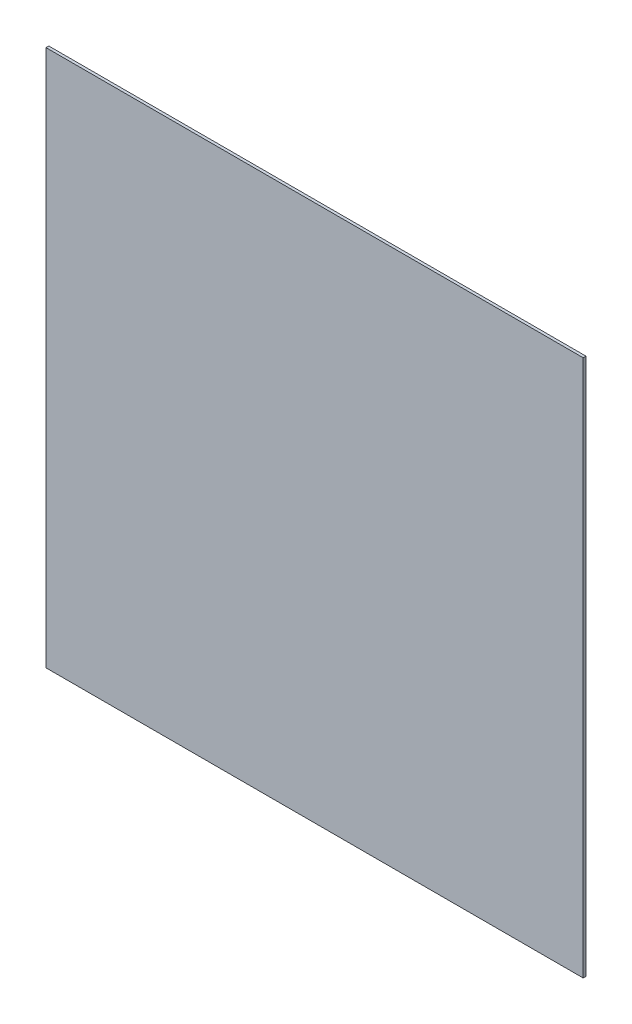
ISO-10303-21;
HEADER;
FILE_DESCRIPTION(('STEP AP214'),'2;1');
FILE_NAME('part.step','',(''),(''),'','','');
FILE_SCHEMA(('AUTOMOTIVE_DESIGN { 1 0 10303 214 1 1 1 1 }'));
ENDSEC;
DATA;
#1=APPLICATION_CONTEXT('core data for automotive mechanical design processes');
#2=APPLICATION_PROTOCOL_DEFINITION('international standard','automotive_design',2000,#1);
#3=PRODUCT_CONTEXT('',#1,'mechanical');
#4=PRODUCT('Part','Part','',(#3));
#5=PRODUCT_RELATED_PRODUCT_CATEGORY('part','',(#4));
#6=PRODUCT_DEFINITION_FORMATION('','',#4);
#7=PRODUCT_DEFINITION_CONTEXT('part definition',#1,'design');
#8=PRODUCT_DEFINITION('design','',#6,#7);
#9=PRODUCT_DEFINITION_SHAPE('','',#8);
#10=(LENGTH_UNIT() NAMED_UNIT(*) SI_UNIT(.MILLI.,.METRE.));
#11=(NAMED_UNIT(*) PLANE_ANGLE_UNIT() SI_UNIT($,.RADIAN.));
#12=(NAMED_UNIT(*) SI_UNIT($,.STERADIAN.) SOLID_ANGLE_UNIT());
#13=UNCERTAINTY_MEASURE_WITH_UNIT(LENGTH_MEASURE(1.E-05),#10,'distance_accuracy_value','');
#14=(GEOMETRIC_REPRESENTATION_CONTEXT(3) GLOBAL_UNCERTAINTY_ASSIGNED_CONTEXT((#13)) GLOBAL_UNIT_ASSIGNED_CONTEXT((#10,
#11,#12)) REPRESENTATION_CONTEXT('',''));
#15=CARTESIAN_POINT('',(0.,0.,0.));
#16=DIRECTION('',(0.,0.,1.));
#17=DIRECTION('',(1.,0.,0.));
#18=AXIS2_PLACEMENT_3D('',#15,#16,#17);
#19=CARTESIAN_POINT('',(609.6,0.,3.175));
#20=DIRECTION('',(0.,1.,0.));
#21=DIRECTION('',(0.,0.,1.));
#22=AXIS2_PLACEMENT_3D('',#19,#20,#21);
#23=PLANE('',#22);
#24=DIRECTION('',(1.,0.,0.));
#25=VECTOR('',#24,1.);
#26=CARTESIAN_POINT('',(609.6,0.,0.));
#27=LINE('',#26,#25);
#28=CARTESIAN_POINT('',(0.,0.,0.));
#29=VERTEX_POINT('',#28);
#30=CARTESIAN_POINT('',(609.6,0.,0.));
#31=VERTEX_POINT('',#30);
#32=EDGE_CURVE('E96',#29,#31,#27,.T.);
#33=ORIENTED_EDGE('',*,*,#32,.T.);
#34=DIRECTION('',(0.,0.,-1.));
#35=VECTOR('',#34,1.);
#36=CARTESIAN_POINT('',(609.6,0.,3.175));
#37=LINE('',#36,#35);
#38=CARTESIAN_POINT('',(609.6,0.,3.175));
#39=VERTEX_POINT('',#38);
#40=EDGE_CURVE('E11',#39,#31,#37,.T.);
#41=ORIENTED_EDGE('',*,*,#40,.F.);
#42=DIRECTION('',(1.,0.,0.));
#43=VECTOR('',#42,1.);
#44=CARTESIAN_POINT('',(609.6,0.,3.175));
#45=LINE('',#44,#43);
#46=CARTESIAN_POINT('',(0.,0.,3.175));
#47=VERTEX_POINT('',#46);
#48=EDGE_CURVE('E84',#47,#39,#45,.T.);
#49=ORIENTED_EDGE('',*,*,#48,.F.);
#50=DIRECTION('',(0.,0.,-1.));
#51=VECTOR('',#50,1.);
#52=CARTESIAN_POINT('',(0.,0.,3.175));
#53=LINE('',#52,#51);
#54=EDGE_CURVE('E92',#47,#29,#53,.T.);
#55=ORIENTED_EDGE('',*,*,#54,.T.);
#56=EDGE_LOOP('',(#33,#41,#49,#55));
#57=FACE_BOUND('',#56,.T.);
#58=ADVANCED_FACE('F33',(#57),#23,.F.);
#59=CARTESIAN_POINT('',(609.6,609.6,3.175));
#60=DIRECTION('',(-1.,0.,0.));
#61=DIRECTION('',(0.,0.,1.));
#62=AXIS2_PLACEMENT_3D('',#59,#60,#61);
#63=PLANE('',#62);
#64=DIRECTION('',(0.,1.,0.));
#65=VECTOR('',#64,1.);
#66=CARTESIAN_POINT('',(609.6,609.6,0.));
#67=LINE('',#66,#65);
#68=CARTESIAN_POINT('',(609.6,609.6,0.));
#69=VERTEX_POINT('',#68);
#70=EDGE_CURVE('E88',#31,#69,#67,.T.);
#71=ORIENTED_EDGE('',*,*,#70,.T.);
#72=DIRECTION('',(0.,0.,-1.));
#73=VECTOR('',#72,1.);
#74=CARTESIAN_POINT('',(609.6,609.6,3.175));
#75=LINE('',#74,#73);
#76=CARTESIAN_POINT('',(609.6,609.6,3.175));
#77=VERTEX_POINT('',#76);
#78=EDGE_CURVE('E41',#77,#69,#75,.T.);
#79=ORIENTED_EDGE('',*,*,#78,.F.);
#80=DIRECTION('',(0.,1.,0.));
#81=VECTOR('',#80,1.);
#82=CARTESIAN_POINT('',(609.6,609.6,3.175));
#83=LINE('',#82,#81);
#84=EDGE_CURVE('E79',#39,#77,#83,.T.);
#85=ORIENTED_EDGE('',*,*,#84,.F.);
#86=ORIENTED_EDGE('',*,*,#40,.T.);
#87=EDGE_LOOP('',(#71,#79,#85,#86));
#88=FACE_BOUND('',#87,.T.);
#89=ADVANCED_FACE('F87',(#88),#63,.F.);
#90=CARTESIAN_POINT('',(0.,609.6,3.175));
#91=DIRECTION('',(0.,-1.,0.));
#92=DIRECTION('',(0.,0.,-1.));
#93=AXIS2_PLACEMENT_3D('',#90,#91,#92);
#94=PLANE('',#93);
#95=DIRECTION('',(-1.,0.,0.));
#96=VECTOR('',#95,1.);
#97=CARTESIAN_POINT('',(0.,609.6,0.));
#98=LINE('',#97,#96);
#99=CARTESIAN_POINT('',(0.,609.6,0.));
#100=VERTEX_POINT('',#99);
#101=EDGE_CURVE('E66',#69,#100,#98,.T.);
#102=ORIENTED_EDGE('',*,*,#101,.T.);
#103=DIRECTION('',(0.,0.,-1.));
#104=VECTOR('',#103,1.);
#105=CARTESIAN_POINT('',(0.,609.6,3.175));
#106=LINE('',#105,#104);
#107=CARTESIAN_POINT('',(0.,609.6,3.175));
#108=VERTEX_POINT('',#107);
#109=EDGE_CURVE('E89',#108,#100,#106,.T.);
#110=ORIENTED_EDGE('',*,*,#109,.F.);
#111=DIRECTION('',(-1.,0.,0.));
#112=VECTOR('',#111,1.);
#113=CARTESIAN_POINT('',(0.,609.6,3.175));
#114=LINE('',#113,#112);
#115=EDGE_CURVE('E82',#77,#108,#114,.T.);
#116=ORIENTED_EDGE('',*,*,#115,.F.);
#117=ORIENTED_EDGE('',*,*,#78,.T.);
#118=EDGE_LOOP('',(#102,#110,#116,#117));
#119=FACE_BOUND('',#118,.T.);
#120=ADVANCED_FACE('F90',(#119),#94,.F.);
#121=CARTESIAN_POINT('',(0.,0.,3.175));
#122=DIRECTION('',(1.,0.,0.));
#123=DIRECTION('',(0.,0.,-1.));
#124=AXIS2_PLACEMENT_3D('',#121,#122,#123);
#125=PLANE('',#124);
#126=DIRECTION('',(0.,-1.,0.));
#127=VECTOR('',#126,1.);
#128=CARTESIAN_POINT('',(0.,0.,0.));
#129=LINE('',#128,#127);
#130=EDGE_CURVE('E72',#100,#29,#129,.T.);
#131=ORIENTED_EDGE('',*,*,#130,.T.);
#132=ORIENTED_EDGE('',*,*,#54,.F.);
#133=DIRECTION('',(0.,-1.,0.));
#134=VECTOR('',#133,1.);
#135=CARTESIAN_POINT('',(0.,0.,3.175));
#136=LINE('',#135,#134);
#137=EDGE_CURVE('E49',#108,#47,#136,.T.);
#138=ORIENTED_EDGE('',*,*,#137,.F.);
#139=ORIENTED_EDGE('',*,*,#109,.T.);
#140=EDGE_LOOP('',(#131,#132,#138,#139));
#141=FACE_BOUND('',#140,.T.);
#142=ADVANCED_FACE('F103',(#141),#125,.F.);
#143=CARTESIAN_POINT('',(0.,0.,3.175));
#144=DIRECTION('',(0.,0.,-1.));
#145=DIRECTION('',(-1.,0.,0.));
#146=AXIS2_PLACEMENT_3D('',#143,#144,#145);
#147=PLANE('',#146);
#148=ORIENTED_EDGE('',*,*,#48,.T.);
#149=ORIENTED_EDGE('',*,*,#84,.T.);
#150=ORIENTED_EDGE('',*,*,#115,.T.);
#151=ORIENTED_EDGE('',*,*,#137,.T.);
#152=EDGE_LOOP('',(#148,#149,#150,#151));
#153=FACE_BOUND('',#152,.T.);
#154=ADVANCED_FACE('F80',(#153),#147,.F.);
#155=CARTESIAN_POINT('',(0.,0.,0.));
#156=DIRECTION('',(0.,0.,-1.));
#157=DIRECTION('',(-1.,0.,0.));
#158=AXIS2_PLACEMENT_3D('',#155,#156,#157);
#159=PLANE('',#158);
#160=ORIENTED_EDGE('',*,*,#32,.F.);
#161=ORIENTED_EDGE('',*,*,#130,.F.);
#162=ORIENTED_EDGE('',*,*,#101,.F.);
#163=ORIENTED_EDGE('',*,*,#70,.F.);
#164=EDGE_LOOP('',(#160,#161,#162,#163));
#165=FACE_BOUND('',#164,.T.);
#166=ADVANCED_FACE('F106',(#165),#159,.T.);
#167=CLOSED_SHELL('',(#58,#89,#120,#142,#154,#166));
#168=MANIFOLD_SOLID_BREP('B2',#167);
#169=ADVANCED_BREP_SHAPE_REPRESENTATION('',(#18,#168),#14);
#170=SHAPE_DEFINITION_REPRESENTATION(#9,#169);
ENDSEC;
END-ISO-10303-21;
